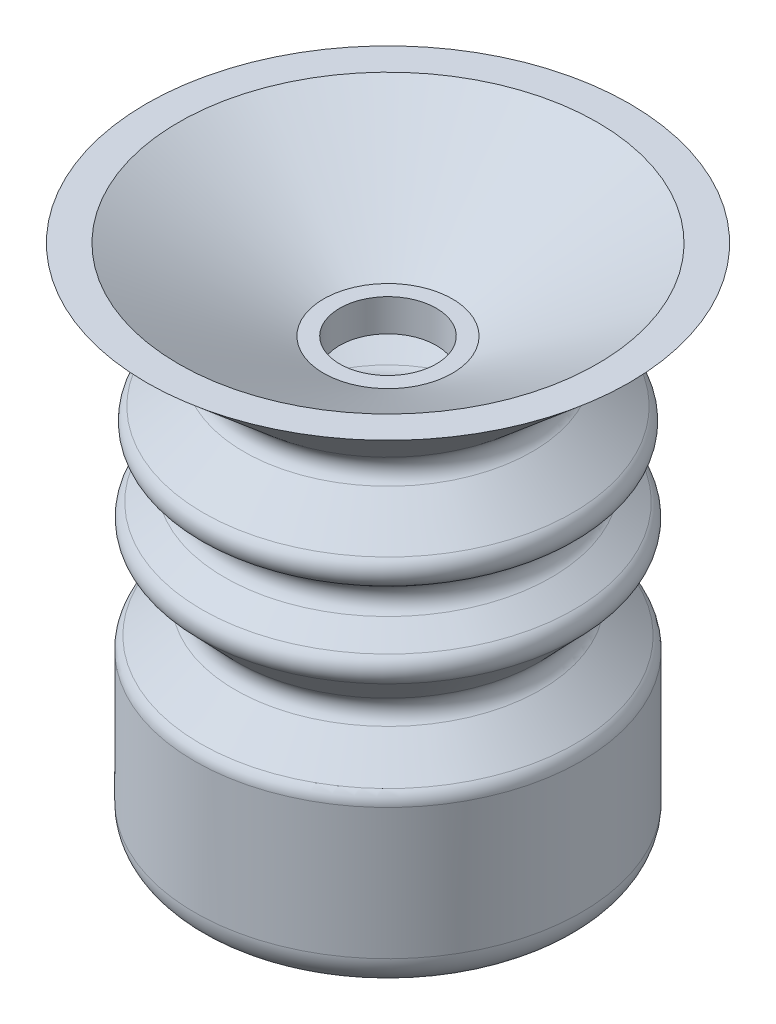
ISO-10303-21;
HEADER;
FILE_DESCRIPTION(('STEP AP214'),'2;1');
FILE_NAME('part.step','',(''),(''),'','','');
FILE_SCHEMA(('AUTOMOTIVE_DESIGN { 1 0 10303 214 1 1 1 1 }'));
ENDSEC;
DATA;
#1=APPLICATION_CONTEXT('core data for automotive mechanical design processes');
#2=APPLICATION_PROTOCOL_DEFINITION('international standard','automotive_design',2000,#1);
#3=PRODUCT_CONTEXT('',#1,'mechanical');
#4=PRODUCT('Part','Part','',(#3));
#5=PRODUCT_RELATED_PRODUCT_CATEGORY('part','',(#4));
#6=PRODUCT_DEFINITION_FORMATION('','',#4);
#7=PRODUCT_DEFINITION_CONTEXT('part definition',#1,'design');
#8=PRODUCT_DEFINITION('design','',#6,#7);
#9=PRODUCT_DEFINITION_SHAPE('','',#8);
#10=(LENGTH_UNIT() NAMED_UNIT(*) SI_UNIT(.MILLI.,.METRE.));
#11=(NAMED_UNIT(*) PLANE_ANGLE_UNIT() SI_UNIT($,.RADIAN.));
#12=(NAMED_UNIT(*) SI_UNIT($,.STERADIAN.) SOLID_ANGLE_UNIT());
#13=UNCERTAINTY_MEASURE_WITH_UNIT(LENGTH_MEASURE(1.E-05),#10,'distance_accuracy_value','');
#14=(GEOMETRIC_REPRESENTATION_CONTEXT(3) GLOBAL_UNCERTAINTY_ASSIGNED_CONTEXT((#13)) GLOBAL_UNIT_ASSIGNED_CONTEXT((#10,
#11,#12)) REPRESENTATION_CONTEXT('',''));
#15=CARTESIAN_POINT('',(0.,0.,0.));
#16=DIRECTION('',(0.,0.,1.));
#17=DIRECTION('',(1.,0.,0.));
#18=AXIS2_PLACEMENT_3D('',#15,#16,#17);
#19=CARTESIAN_POINT('',(6.,0.,0.));
#20=DIRECTION('',(0.,-1.,0.));
#21=DIRECTION('',(0.,0.,-1.));
#22=AXIS2_PLACEMENT_3D('',#19,#20,#21);
#23=PLANE('',#22);
#24=CARTESIAN_POINT('',(0.,0.,0.));
#25=DIRECTION('',(0.,-1.,0.));
#26=DIRECTION('',(0.,0.,-1.));
#27=AXIS2_PLACEMENT_3D('',#24,#25,#26);
#28=CIRCLE('',#27,5.);
#29=CARTESIAN_POINT('',(0.,0.,-5.));
#30=VERTEX_POINT('',#29);
#31=EDGE_CURVE('E37',#30,#30,#28,.T.);
#32=ORIENTED_EDGE('',*,*,#31,.T.);
#33=EDGE_LOOP('',(#32));
#34=FACE_BOUND('',#33,.T.);
#35=CARTESIAN_POINT('',(0.,0.,0.));
#36=DIRECTION('',(0.,-1.,0.));
#37=DIRECTION('',(0.,0.,-1.));
#38=AXIS2_PLACEMENT_3D('',#35,#36,#37);
#39=CIRCLE('',#38,2.5);
#40=CARTESIAN_POINT('',(0.,0.,-2.5));
#41=VERTEX_POINT('',#40);
#42=EDGE_CURVE('E104',#41,#41,#39,.T.);
#43=ORIENTED_EDGE('',*,*,#42,.F.);
#44=EDGE_LOOP('',(#43));
#45=FACE_BOUND('',#44,.T.);
#46=ADVANCED_FACE('F30',(#34,#45),#23,.T.);
#47=CARTESIAN_POINT('',(0.,0.,0.));
#48=DIRECTION('',(0.,-1.,0.));
#49=DIRECTION('',(0.,0.,-1.));
#50=AXIS2_PLACEMENT_3D('',#47,#48,#49);
#51=CYLINDRICAL_SURFACE('',#50,2.5);
#52=ORIENTED_EDGE('',*,*,#42,.T.);
#53=EDGE_LOOP('',(#52));
#54=FACE_BOUND('',#53,.T.);
#55=CARTESIAN_POINT('',(0.,3.,0.));
#56=DIRECTION('',(0.,-1.,0.));
#57=DIRECTION('',(0.,0.,-1.));
#58=AXIS2_PLACEMENT_3D('',#55,#56,#57);
#59=CIRCLE('',#58,2.5);
#60=CARTESIAN_POINT('',(0.,3.,-2.5));
#61=VERTEX_POINT('',#60);
#62=EDGE_CURVE('E107',#61,#61,#59,.T.);
#63=ORIENTED_EDGE('',*,*,#62,.F.);
#64=EDGE_LOOP('',(#63));
#65=FACE_BOUND('',#64,.T.);
#66=ADVANCED_FACE('F156',(#54,#65),#51,.F.);
#67=CARTESIAN_POINT('',(2.5,3.,0.));
#68=DIRECTION('',(0.,1.,0.));
#69=DIRECTION('',(0.,0.,1.));
#70=AXIS2_PLACEMENT_3D('',#67,#68,#69);
#71=PLANE('',#70);
#72=ORIENTED_EDGE('',*,*,#62,.T.);
#73=EDGE_LOOP('',(#72));
#74=FACE_BOUND('',#73,.T.);
#75=CARTESIAN_POINT('',(0.,3.,0.));
#76=DIRECTION('',(0.,-1.,0.));
#77=DIRECTION('',(0.,0.,-1.));
#78=AXIS2_PLACEMENT_3D('',#75,#76,#77);
#79=CIRCLE('',#78,3.5);
#80=CARTESIAN_POINT('',(0.,3.,-3.5));
#81=VERTEX_POINT('',#80);
#82=EDGE_CURVE('E110',#81,#81,#79,.T.);
#83=ORIENTED_EDGE('',*,*,#82,.F.);
#84=EDGE_LOOP('',(#83));
#85=FACE_BOUND('',#84,.T.);
#86=ADVANCED_FACE('F161',(#74,#85),#71,.T.);
#87=CARTESIAN_POINT('',(0.,0.,0.));
#88=DIRECTION('',(0.,-1.,0.));
#89=DIRECTION('',(0.,0.,-1.));
#90=AXIS2_PLACEMENT_3D('',#87,#88,#89);
#91=CYLINDRICAL_SURFACE('',#90,3.5);
#92=ORIENTED_EDGE('',*,*,#82,.T.);
#93=EDGE_LOOP('',(#92));
#94=FACE_BOUND('',#93,.T.);
#95=CARTESIAN_POINT('',(0.,5.,0.));
#96=DIRECTION('',(0.,-1.,0.));
#97=DIRECTION('',(0.,0.,-1.));
#98=AXIS2_PLACEMENT_3D('',#95,#96,#97);
#99=CIRCLE('',#98,3.5);
#100=CARTESIAN_POINT('',(0.,5.,-3.5));
#101=VERTEX_POINT('',#100);
#102=EDGE_CURVE('E113',#101,#101,#99,.T.);
#103=ORIENTED_EDGE('',*,*,#102,.F.);
#104=EDGE_LOOP('',(#103));
#105=FACE_BOUND('',#104,.T.);
#106=ADVANCED_FACE('F305',(#94,#105),#91,.F.);
#107=CARTESIAN_POINT('',(2.5,5.,0.));
#108=DIRECTION('',(0.,-1.,0.));
#109=DIRECTION('',(0.,0.,-1.));
#110=AXIS2_PLACEMENT_3D('',#107,#108,#109);
#111=PLANE('',#110);
#112=ORIENTED_EDGE('',*,*,#102,.T.);
#113=EDGE_LOOP('',(#112));
#114=FACE_BOUND('',#113,.T.);
#115=CARTESIAN_POINT('',(0.,5.,0.));
#116=DIRECTION('',(0.,-1.,0.));
#117=DIRECTION('',(0.,0.,-1.));
#118=AXIS2_PLACEMENT_3D('',#115,#116,#117);
#119=CIRCLE('',#118,2.5);
#120=CARTESIAN_POINT('',(0.,5.,-2.5));
#121=VERTEX_POINT('',#120);
#122=EDGE_CURVE('E116',#121,#121,#119,.T.);
#123=ORIENTED_EDGE('',*,*,#122,.F.);
#124=EDGE_LOOP('',(#123));
#125=FACE_BOUND('',#124,.T.);
#126=ADVANCED_FACE('F313',(#114,#125),#111,.T.);
#127=CARTESIAN_POINT('',(0.,0.,0.));
#128=DIRECTION('',(0.,-1.,0.));
#129=DIRECTION('',(0.,0.,-1.));
#130=AXIS2_PLACEMENT_3D('',#127,#128,#129);
#131=CYLINDRICAL_SURFACE('',#130,2.5);
#132=CARTESIAN_POINT('',(0.,7.03748536048925,0.));
#133=DIRECTION('',(0.,1.,0.));
#134=DIRECTION('',(0.,0.,1.));
#135=AXIS2_PLACEMENT_3D('',#132,#133,#134);
#136=CIRCLE('',#135,2.5);
#137=CARTESIAN_POINT('',(0.,7.03748536048925,2.5));
#138=VERTEX_POINT('',#137);
#139=EDGE_CURVE('E83',#138,#138,#136,.T.);
#140=ORIENTED_EDGE('',*,*,#139,.T.);
#141=EDGE_LOOP('',(#140));
#142=FACE_BOUND('',#141,.T.);
#143=ORIENTED_EDGE('',*,*,#122,.T.);
#144=EDGE_LOOP('',(#143));
#145=FACE_BOUND('',#144,.T.);
#146=ADVANCED_FACE('F322',(#142,#145),#131,.F.);
#147=CARTESIAN_POINT('',(0.,8.7,0.));
#148=DIRECTION('',(0.,1.,0.));
#149=DIRECTION('',(0.,0.,1.));
#150=AXIS2_PLACEMENT_3D('',#147,#148,#149);
#151=CONICAL_SURFACE('',#150,4.52953494659147,0.966939907955442);
#152=CARTESIAN_POINT('',(0.,8.29555694338188,0.));
#153=DIRECTION('',(0.,1.,0.));
#154=DIRECTION('',(0.,0.,1.));
#155=AXIS2_PLACEMENT_3D('',#152,#153,#154);
#156=CIRCLE('',#155,3.94322686279664);
#157=CARTESIAN_POINT('',(0.,8.29555694338188,3.94322686279664));
#158=VERTEX_POINT('',#157);
#159=EDGE_CURVE('E92',#158,#158,#156,.T.);
#160=ORIENTED_EDGE('',*,*,#159,.T.);
#161=EDGE_LOOP('',(#160));
#162=FACE_BOUND('',#161,.T.);
#163=CARTESIAN_POINT('',(0.,7.4490613531197,0.));
#164=DIRECTION('',(0.,-1.,0.));
#165=DIRECTION('',(0.,0.,-1.));
#166=AXIS2_PLACEMENT_3D('',#163,#164,#165);
#167=CIRCLE('',#166,2.71608944667332);
#168=CARTESIAN_POINT('',(0.,7.4490613531197,-2.71608944667332));
#169=VERTEX_POINT('',#168);
#170=EDGE_CURVE('E95',#169,#169,#167,.T.);
#171=ORIENTED_EDGE('',*,*,#170,.T.);
#172=EDGE_LOOP('',(#171));
#173=FACE_BOUND('',#172,.T.);
#174=ADVANCED_FACE('F332',(#162,#173),#151,.F.);
#175=CARTESIAN_POINT('',(0.,9.9072557164106,0.));
#176=DIRECTION('',(0.,-1.,0.));
#177=DIRECTION('',(0.,0.,-1.));
#178=AXIS2_PLACEMENT_3D('',#175,#176,#177);
#179=CONICAL_SURFACE('',#178,2.83937694361663,0.950546840812076);
#180=CARTESIAN_POINT('',(0.,9.11399967161569,0.));
#181=DIRECTION('',(0.,-1.,0.));
#182=DIRECTION('',(0.,0.,-1.));
#183=AXIS2_PLACEMENT_3D('',#180,#181,#182);
#184=CIRCLE('',#183,3.94993540632951);
#185=CARTESIAN_POINT('',(0.,9.11399967161569,-3.94993540632951));
#186=VERTEX_POINT('',#185);
#187=EDGE_CURVE('E98',#186,#186,#184,.T.);
#188=ORIENTED_EDGE('',*,*,#187,.T.);
#189=EDGE_LOOP('',(#188));
#190=FACE_BOUND('',#189,.T.);
#191=CARTESIAN_POINT('',(0.,9.50038898080723,0.));
#192=DIRECTION('',(0.,1.,0.));
#193=DIRECTION('',(0.,0.,1.));
#194=AXIS2_PLACEMENT_3D('',#191,#192,#193);
#195=CIRCLE('',#194,3.40899037346134);
#196=CARTESIAN_POINT('',(0.,9.50038898080723,3.40899037346134));
#197=VERTEX_POINT('',#196);
#198=EDGE_CURVE('E101',#197,#197,#195,.T.);
#199=ORIENTED_EDGE('',*,*,#198,.T.);
#200=EDGE_LOOP('',(#199));
#201=FACE_BOUND('',#200,.T.);
#202=ADVANCED_FACE('F341',(#190,#201),#179,.F.);
#203=CARTESIAN_POINT('',(0.,11.2,0.));
#204=DIRECTION('',(0.,1.,0.));
#205=DIRECTION('',(0.,0.,1.));
#206=AXIS2_PLACEMENT_3D('',#203,#204,#205);
#207=CONICAL_SURFACE('',#206,4.64921894064179,0.950546840812074);
#208=CARTESIAN_POINT('',(0.,10.314122452014,0.));
#209=DIRECTION('',(0.,-1.,0.));
#210=DIRECTION('',(0.,0.,-1.));
#211=AXIS2_PLACEMENT_3D('',#208,#209,#210);
#212=CIRCLE('',#211,3.40899037346134);
#213=CARTESIAN_POINT('',(0.,10.314122452014,-3.40899037346134));
#214=VERTEX_POINT('',#213);
#215=EDGE_CURVE('E86',#214,#214,#212,.T.);
#216=ORIENTED_EDGE('',*,*,#215,.T.);
#217=EDGE_LOOP('',(#216));
#218=FACE_BOUND('',#217,.T.);
#219=CARTESIAN_POINT('',(0.,10.8157151500665,0.));
#220=DIRECTION('',(0.,1.,0.));
#221=DIRECTION('',(0.,0.,1.));
#222=AXIS2_PLACEMENT_3D('',#219,#220,#221);
#223=CIRCLE('',#222,4.11122015073489);
#224=CARTESIAN_POINT('',(0.,10.8157151500665,4.11122015073489));
#225=VERTEX_POINT('',#224);
#226=EDGE_CURVE('E89',#225,#225,#223,.T.);
#227=ORIENTED_EDGE('',*,*,#226,.T.);
#228=EDGE_LOOP('',(#227));
#229=FACE_BOUND('',#228,.T.);
#230=ADVANCED_FACE('F350',(#218,#229),#207,.F.);
#231=CARTESIAN_POINT('',(0.,12.5,0.));
#232=DIRECTION('',(0.,-1.,0.));
#233=DIRECTION('',(0.,0.,-1.));
#234=AXIS2_PLACEMENT_3D('',#231,#232,#233);
#235=CONICAL_SURFACE('',#234,3.02421894064179,0.896055384571344);
#236=CARTESIAN_POINT('',(0.,11.6130162903914,0.));
#237=DIRECTION('',(0.,-1.,0.));
#238=DIRECTION('',(0.,0.,-1.));
#239=AXIS2_PLACEMENT_3D('',#236,#237,#238);
#240=CIRCLE('',#239,4.13294857765256);
#241=CARTESIAN_POINT('',(0.,11.6130162903914,-4.13294857765256));
#242=VERTEX_POINT('',#241);
#243=EDGE_CURVE('E45',#242,#242,#240,.T.);
#244=ORIENTED_EDGE('',*,*,#243,.T.);
#245=EDGE_LOOP('',(#244));
#246=FACE_BOUND('',#245,.T.);
#247=CARTESIAN_POINT('',(0.,12.5,0.));
#248=DIRECTION('',(0.,-1.,0.));
#249=DIRECTION('',(0.,0.,-1.));
#250=AXIS2_PLACEMENT_3D('',#247,#248,#249);
#251=CIRCLE('',#250,3.02421894064179);
#252=CARTESIAN_POINT('',(0.,12.5,-3.02421894064179));
#253=VERTEX_POINT('',#252);
#254=EDGE_CURVE('E119',#253,#253,#251,.T.);
#255=ORIENTED_EDGE('',*,*,#254,.F.);
#256=EDGE_LOOP('',(#255));
#257=FACE_BOUND('',#256,.T.);
#258=ADVANCED_FACE('F359',(#246,#257),#235,.F.);
#259=CARTESIAN_POINT('',(1.5,12.5,0.));
#260=DIRECTION('',(0.,-1.,0.));
#261=DIRECTION('',(0.,0.,-1.));
#262=AXIS2_PLACEMENT_3D('',#259,#260,#261);
#263=PLANE('',#262);
#264=ORIENTED_EDGE('',*,*,#254,.T.);
#265=EDGE_LOOP('',(#264));
#266=FACE_BOUND('',#265,.T.);
#267=CARTESIAN_POINT('',(0.,12.5,0.));
#268=DIRECTION('',(0.,-1.,0.));
#269=DIRECTION('',(0.,0.,-1.));
#270=AXIS2_PLACEMENT_3D('',#267,#268,#269);
#271=CIRCLE('',#270,1.5);
#272=CARTESIAN_POINT('',(0.,12.5,-1.5));
#273=VERTEX_POINT('',#272);
#274=EDGE_CURVE('E122',#273,#273,#271,.T.);
#275=ORIENTED_EDGE('',*,*,#274,.F.);
#276=EDGE_LOOP('',(#275));
#277=FACE_BOUND('',#276,.T.);
#278=ADVANCED_FACE('F368',(#266,#277),#263,.T.);
#279=CARTESIAN_POINT('',(0.,0.,0.));
#280=DIRECTION('',(0.,-1.,0.));
#281=DIRECTION('',(0.,0.,-1.));
#282=AXIS2_PLACEMENT_3D('',#279,#280,#281);
#283=CYLINDRICAL_SURFACE('',#282,1.5);
#284=ORIENTED_EDGE('',*,*,#274,.T.);
#285=EDGE_LOOP('',(#284));
#286=FACE_BOUND('',#285,.T.);
#287=CARTESIAN_POINT('',(0.,13.5,0.));
#288=DIRECTION('',(0.,-1.,0.));
#289=DIRECTION('',(0.,0.,-1.));
#290=AXIS2_PLACEMENT_3D('',#287,#288,#289);
#291=CIRCLE('',#290,1.5);
#292=CARTESIAN_POINT('',(0.,13.5,-1.5));
#293=VERTEX_POINT('',#292);
#294=EDGE_CURVE('E125',#293,#293,#291,.T.);
#295=ORIENTED_EDGE('',*,*,#294,.F.);
#296=EDGE_LOOP('',(#295));
#297=FACE_BOUND('',#296,.T.);
#298=ADVANCED_FACE('F377',(#286,#297),#283,.F.);
#299=CARTESIAN_POINT('',(2.,13.5,0.));
#300=DIRECTION('',(0.,1.,0.));
#301=DIRECTION('',(0.,0.,1.));
#302=AXIS2_PLACEMENT_3D('',#299,#300,#301);
#303=PLANE('',#302);
#304=ORIENTED_EDGE('',*,*,#294,.T.);
#305=EDGE_LOOP('',(#304));
#306=FACE_BOUND('',#305,.T.);
#307=CARTESIAN_POINT('',(0.,13.5,0.));
#308=DIRECTION('',(0.,-1.,0.));
#309=DIRECTION('',(0.,0.,-1.));
#310=AXIS2_PLACEMENT_3D('',#307,#308,#309);
#311=CIRCLE('',#310,2.);
#312=CARTESIAN_POINT('',(0.,13.5,2.));
#313=VERTEX_POINT('',#312);
#314=EDGE_CURVE('E128',#313,#313,#311,.T.);
#315=ORIENTED_EDGE('',*,*,#314,.F.);
#316=EDGE_LOOP('',(#315));
#317=FACE_BOUND('',#316,.T.);
#318=ADVANCED_FACE('F152',(#306,#317),#303,.T.);
#319=CARTESIAN_POINT('',(0.,16.,0.));
#320=DIRECTION('',(0.,1.,0.));
#321=DIRECTION('',(0.,0.,1.));
#322=AXIS2_PLACEMENT_3D('',#319,#320,#321);
#323=CONICAL_SURFACE('',#322,6.5,1.06369782240256);
#324=CARTESIAN_POINT('',(0.,16.,0.));
#325=DIRECTION('',(0.,-1.,0.));
#326=DIRECTION('',(0.,0.,-1.));
#327=AXIS2_PLACEMENT_3D('',#324,#325,#326);
#328=CIRCLE('',#327,6.5);
#329=CARTESIAN_POINT('',(0.,16.,6.5));
#330=VERTEX_POINT('',#329);
#331=EDGE_CURVE('E131',#330,#330,#328,.T.);
#332=CARTESIAN_POINT('',(0.,13.5,2.));
#333=CARTESIAN_POINT('',(0.,13.5260416666667,2.046875));
#334=CARTESIAN_POINT('',(0.,13.5520833333333,2.09375));
#335=CARTESIAN_POINT('',(0.,13.6041666666667,2.1875));
#336=CARTESIAN_POINT('',(0.,13.6302083333333,2.234375));
#337=CARTESIAN_POINT('',(0.,13.6822916666667,2.328125));
#338=CARTESIAN_POINT('',(0.,13.7083333333333,2.375));
#339=CARTESIAN_POINT('',(0.,13.7604166666667,2.46875));
#340=CARTESIAN_POINT('',(0.,13.7864583333333,2.515625));
#341=CARTESIAN_POINT('',(0.,13.8385416666667,2.609375));
#342=CARTESIAN_POINT('',(0.,13.8645833333333,2.65625));
#343=CARTESIAN_POINT('',(0.,13.9166666666667,2.75));
#344=CARTESIAN_POINT('',(0.,13.9427083333333,2.796875));
#345=CARTESIAN_POINT('',(0.,13.9947916666667,2.890625));
#346=CARTESIAN_POINT('',(0.,14.0208333333333,2.9375));
#347=CARTESIAN_POINT('',(0.,14.0729166666667,3.03125));
#348=CARTESIAN_POINT('',(0.,14.0989583333333,3.078125));
#349=CARTESIAN_POINT('',(0.,14.1510416666667,3.171875));
#350=CARTESIAN_POINT('',(0.,14.1770833333333,3.21875));
#351=CARTESIAN_POINT('',(0.,14.2291666666667,3.3125));
#352=CARTESIAN_POINT('',(0.,14.2552083333333,3.359375));
#353=CARTESIAN_POINT('',(0.,14.3072916666667,3.453125));
#354=CARTESIAN_POINT('',(0.,14.3333333333333,3.5));
#355=CARTESIAN_POINT('',(0.,14.3854166666667,3.59375));
#356=CARTESIAN_POINT('',(0.,14.4114583333333,3.640625));
#357=CARTESIAN_POINT('',(0.,14.4635416666667,3.734375));
#358=CARTESIAN_POINT('',(0.,14.4895833333333,3.78125));
#359=CARTESIAN_POINT('',(0.,14.5416666666667,3.875));
#360=CARTESIAN_POINT('',(0.,14.5677083333333,3.921875));
#361=CARTESIAN_POINT('',(0.,14.6197916666667,4.015625));
#362=CARTESIAN_POINT('',(0.,14.6458333333333,4.0625));
#363=CARTESIAN_POINT('',(0.,14.6979166666667,4.15625));
#364=CARTESIAN_POINT('',(0.,14.7239583333333,4.203125));
#365=CARTESIAN_POINT('',(0.,14.7760416666667,4.296875));
#366=CARTESIAN_POINT('',(0.,14.8020833333333,4.34375));
#367=CARTESIAN_POINT('',(0.,14.8541666666667,4.4375));
#368=CARTESIAN_POINT('',(0.,14.8802083333333,4.484375));
#369=CARTESIAN_POINT('',(0.,14.9322916666667,4.578125));
#370=CARTESIAN_POINT('',(0.,14.9583333333333,4.625));
#371=CARTESIAN_POINT('',(0.,15.0104166666667,4.71875));
#372=CARTESIAN_POINT('',(0.,15.0364583333333,4.765625));
#373=CARTESIAN_POINT('',(0.,15.0885416666667,4.859375));
#374=CARTESIAN_POINT('',(0.,15.1145833333333,4.90625));
#375=CARTESIAN_POINT('',(0.,15.1666666666667,5.));
#376=CARTESIAN_POINT('',(0.,15.1927083333333,5.046875));
#377=CARTESIAN_POINT('',(0.,15.2447916666667,5.140625));
#378=CARTESIAN_POINT('',(0.,15.2708333333333,5.1875));
#379=CARTESIAN_POINT('',(0.,15.3229166666667,5.28125));
#380=CARTESIAN_POINT('',(0.,15.3489583333333,5.328125));
#381=CARTESIAN_POINT('',(0.,15.4010416666667,5.421875));
#382=CARTESIAN_POINT('',(0.,15.4270833333333,5.46875));
#383=CARTESIAN_POINT('',(0.,15.4791666666667,5.5625));
#384=CARTESIAN_POINT('',(0.,15.5052083333333,5.609375));
#385=CARTESIAN_POINT('',(0.,15.5572916666667,5.703125));
#386=CARTESIAN_POINT('',(0.,15.5833333333333,5.75));
#387=CARTESIAN_POINT('',(0.,15.6354166666667,5.84375));
#388=CARTESIAN_POINT('',(0.,15.6614583333333,5.890625));
#389=CARTESIAN_POINT('',(0.,15.7135416666667,5.984375));
#390=CARTESIAN_POINT('',(0.,15.7395833333333,6.03125));
#391=CARTESIAN_POINT('',(0.,15.7916666666667,6.125));
#392=CARTESIAN_POINT('',(0.,15.8177083333333,6.171875));
#393=CARTESIAN_POINT('',(0.,15.8697916666667,6.265625));
#394=CARTESIAN_POINT('',(0.,15.8958333333333,6.3125));
#395=CARTESIAN_POINT('',(0.,15.9479166666667,6.40625));
#396=CARTESIAN_POINT('',(0.,15.9739583333333,6.453125));
#397=CARTESIAN_POINT('',(0.,16.,6.5));
#398=B_SPLINE_CURVE_WITH_KNOTS('',3,(#332,#333,#334,#335,#336,#337,#338,#339,#340,#341,#342,
#343,#344,#345,#346,#347,#348,#349,#350,#351,#352,#353,#354,#355,#356,#357,#358,#359,#360,#361,
#362,#363,#364,#365,#366,#367,#368,#369,#370,#371,#372,#373,#374,#375,#376,#377,#378,#379,#380,
#381,#382,#383,#384,#385,#386,#387,#388,#389,#390,#391,#392,#393,#394,#395,#396,#397),
.UNSPECIFIED.,.F.,.F.,(4,2,2,2,2,2,2,2,2,2,2,2,2,2,2,2,2,2,2,2,2,2,2,2,2,2,2,2,2,2,2,2,4),(0.,
0.160869220952921,0.321738441905844,0.482607662858765,0.643476883811688,0.804346104764609,
0.965215325717532,1.12608454667045,1.28695376762337,1.4478229885763,1.60869220952922,
1.76956143048214,1.93043065143506,2.09129987238798,2.25216909334091,2.41303831429383,
2.57390753524675,2.73477675619967,2.89564597715259,3.05651519810552,3.21738441905844,
3.37825364001136,3.53912286096428,3.6999920819172,3.86086130287012,4.02173052382305,
4.18259974477597,4.34346896572889,4.50433818668181,4.66520740763473,4.82607662858766,
4.98694584954058,5.1478150704935),.UNSPECIFIED.);
#399=EDGE_CURVE('BSEAM142',#313,#330,#398,.T.);
#400=ORIENTED_EDGE('',*,*,#314,.T.);
#401=ORIENTED_EDGE('',*,*,#331,.F.);
#402=ORIENTED_EDGE('',*,*,#399,.T.);
#403=ORIENTED_EDGE('',*,*,#399,.F.);
#404=EDGE_LOOP('',(#400,#402,#401,#403));
#405=FACE_BOUND('',#404,.T.);
#406=ADVANCED_FACE('F142',(#405),#323,.F.);
#407=CARTESIAN_POINT('',(6.5,16.,0.));
#408=DIRECTION('',(0.,1.,0.));
#409=DIRECTION('',(0.,0.,1.));
#410=AXIS2_PLACEMENT_3D('',#407,#408,#409);
#411=PLANE('',#410);
#412=ORIENTED_EDGE('',*,*,#331,.T.);
#413=EDGE_LOOP('',(#412));
#414=FACE_BOUND('',#413,.T.);
#415=CARTESIAN_POINT('',(0.,16.,0.));
#416=DIRECTION('',(0.,-1.,0.));
#417=DIRECTION('',(0.,0.,-1.));
#418=AXIS2_PLACEMENT_3D('',#415,#416,#417);
#419=CIRCLE('',#418,7.5);
#420=CARTESIAN_POINT('',(0.,16.,-7.5));
#421=VERTEX_POINT('',#420);
#422=EDGE_CURVE('E134',#421,#421,#419,.T.);
#423=ORIENTED_EDGE('',*,*,#422,.F.);
#424=EDGE_LOOP('',(#423));
#425=FACE_BOUND('',#424,.T.);
#426=ADVANCED_FACE('F140',(#414,#425),#411,.T.);
#427=CARTESIAN_POINT('',(0.,13.,0.));
#428=DIRECTION('',(0.,1.,0.));
#429=DIRECTION('',(0.,0.,1.));
#430=AXIS2_PLACEMENT_3D('',#427,#428,#429);
#431=CONICAL_SURFACE('',#430,4.,0.862170054667226);
#432=CARTESIAN_POINT('',(0.,13.3929090563156,0.));
#433=DIRECTION('',(0.,1.,0.));
#434=DIRECTION('',(0.,0.,1.));
#435=AXIS2_PLACEMENT_3D('',#432,#433,#434);
#436=CIRCLE('',#435,4.4583938990349);
#437=CARTESIAN_POINT('',(0.,13.3929090563156,4.4583938990349));
#438=VERTEX_POINT('',#437);
#439=EDGE_CURVE('E41',#438,#438,#436,.T.);
#440=ORIENTED_EDGE('',*,*,#439,.T.);
#441=EDGE_LOOP('',(#440));
#442=FACE_BOUND('',#441,.T.);
#443=ORIENTED_EDGE('',*,*,#422,.T.);
#444=EDGE_LOOP('',(#443));
#445=FACE_BOUND('',#444,.T.);
#446=ADVANCED_FACE('F138',(#442,#445),#431,.T.);
#447=CARTESIAN_POINT('',(0.,11.2,0.));
#448=DIRECTION('',(0.,-1.,0.));
#449=DIRECTION('',(0.,0.,-1.));
#450=AXIS2_PLACEMENT_3D('',#447,#448,#449);
#451=CONICAL_SURFACE('',#450,6.25,0.896055384571344);
#452=CARTESIAN_POINT('',(0.,11.6130162903914,0.));
#453=DIRECTION('',(0.,1.,0.));
#454=DIRECTION('',(0.,0.,1.));
#455=AXIS2_PLACEMENT_3D('',#452,#453,#454);
#456=CIRCLE('',#455,5.73372963701077);
#457=CARTESIAN_POINT('',(0.,11.6130162903914,5.73372963701077));
#458=VERTEX_POINT('',#457);
#459=EDGE_CURVE('E71',#458,#458,#456,.T.);
#460=ORIENTED_EDGE('',*,*,#459,.T.);
#461=EDGE_LOOP('',(#460));
#462=FACE_BOUND('',#461,.T.);
#463=CARTESIAN_POINT('',(0.,12.6228463504115,0.));
#464=DIRECTION('',(0.,-1.,0.));
#465=DIRECTION('',(0.,0.,-1.));
#466=AXIS2_PLACEMENT_3D('',#463,#464,#465);
#467=CIRCLE('',#466,4.47144206198567);
#468=CARTESIAN_POINT('',(0.,12.6228463504115,-4.47144206198567));
#469=VERTEX_POINT('',#468);
#470=EDGE_CURVE('E74',#469,#469,#467,.T.);
#471=ORIENTED_EDGE('',*,*,#470,.T.);
#472=EDGE_LOOP('',(#471));
#473=FACE_BOUND('',#472,.T.);
#474=ADVANCED_FACE('F149',(#462,#473),#451,.T.);
#475=CARTESIAN_POINT('',(0.,9.95,0.));
#476=DIRECTION('',(0.,1.,0.));
#477=DIRECTION('',(0.,0.,1.));
#478=AXIS2_PLACEMENT_3D('',#475,#476,#477);
#479=CONICAL_SURFACE('',#478,4.5,0.950546840812075);
#480=CARTESIAN_POINT('',(0.,10.8157151500665,0.));
#481=DIRECTION('',(0.,-1.,0.));
#482=DIRECTION('',(0.,0.,-1.));
#483=AXIS2_PLACEMENT_3D('',#480,#481,#482);
#484=CIRCLE('',#483,5.71200121009311);
#485=CARTESIAN_POINT('',(0.,10.8157151500665,-5.71200121009311));
#486=VERTEX_POINT('',#485);
#487=EDGE_CURVE('E77',#486,#486,#484,.T.);
#488=ORIENTED_EDGE('',*,*,#487,.T.);
#489=EDGE_LOOP('',(#488));
#490=FACE_BOUND('',#489,.T.);
#491=CARTESIAN_POINT('',(0.,10.3568667356034,0.));
#492=DIRECTION('',(0.,1.,0.));
#493=DIRECTION('',(0.,0.,1.));
#494=AXIS2_PLACEMENT_3D('',#491,#492,#493);
#495=CIRCLE('',#494,5.06961342984471);
#496=CARTESIAN_POINT('',(0.,10.3568667356034,5.06961342984471));
#497=VERTEX_POINT('',#496);
#498=EDGE_CURVE('E80',#497,#497,#495,.T.);
#499=ORIENTED_EDGE('',*,*,#498,.T.);
#500=EDGE_LOOP('',(#499));
#501=FACE_BOUND('',#500,.T.);
#502=ADVANCED_FACE('F215',(#490,#501),#479,.T.);
#503=CARTESIAN_POINT('',(0.,8.7,0.));
#504=DIRECTION('',(0.,-1.,0.));
#505=DIRECTION('',(0.,0.,-1.));
#506=AXIS2_PLACEMENT_3D('',#503,#504,#505);
#507=CONICAL_SURFACE('',#506,6.25,0.950546840812076);
#508=CARTESIAN_POINT('',(0.,9.03591511399486,0.));
#509=DIRECTION('',(0.,1.,0.));
#510=DIRECTION('',(0.,0.,1.));
#511=AXIS2_PLACEMENT_3D('',#508,#509,#510);
#512=CIRCLE('',#511,5.7797188404072);
#513=CARTESIAN_POINT('',(0.,9.03591511399486,5.7797188404072));
#514=VERTEX_POINT('',#513);
#515=EDGE_CURVE('E50',#514,#514,#512,.T.);
#516=ORIENTED_EDGE('',*,*,#515,.T.);
#517=EDGE_LOOP('',(#516));
#518=FACE_BOUND('',#517,.T.);
#519=CARTESIAN_POINT('',(0.,9.54313326439663,0.));
#520=DIRECTION('',(0.,-1.,0.));
#521=DIRECTION('',(0.,0.,-1.));
#522=AXIS2_PLACEMENT_3D('',#519,#520,#521);
#523=CIRCLE('',#522,5.06961342984471);
#524=CARTESIAN_POINT('',(0.,9.54313326439663,-5.06961342984471));
#525=VERTEX_POINT('',#524);
#526=EDGE_CURVE('E53',#525,#525,#523,.T.);
#527=ORIENTED_EDGE('',*,*,#526,.T.);
#528=EDGE_LOOP('',(#527));
#529=FACE_BOUND('',#528,.T.);
#530=ADVANCED_FACE('F221',(#518,#529),#507,.T.);
#531=CARTESIAN_POINT('',(0.,6.7,0.));
#532=DIRECTION('',(0.,1.,0.));
#533=DIRECTION('',(0.,0.,1.));
#534=AXIS2_PLACEMENT_3D('',#531,#532,#533);
#535=CONICAL_SURFACE('',#534,4.3315449703681,0.76459067649956);
#536=CARTESIAN_POINT('',(0.,7.08564716814076,0.));
#537=DIRECTION('',(0.,1.,0.));
#538=DIRECTION('',(0.,0.,1.));
#539=AXIS2_PLACEMENT_3D('',#536,#537,#538);
#540=CIRCLE('',#539,4.70146834505957);
#541=CARTESIAN_POINT('',(0.,7.08564716814076,4.70146834505957));
#542=VERTEX_POINT('',#541);
#543=EDGE_CURVE('E56',#542,#542,#540,.T.);
#544=ORIENTED_EDGE('',*,*,#543,.T.);
#545=EDGE_LOOP('',(#544));
#546=FACE_BOUND('',#545,.T.);
#547=CARTESIAN_POINT('',(0.,8.28292754748942,0.));
#548=DIRECTION('',(0.,-1.,0.));
#549=DIRECTION('',(0.,0.,-1.));
#550=AXIS2_PLACEMENT_3D('',#547,#548,#549);
#551=CIRCLE('',#550,5.84993262788008);
#552=CARTESIAN_POINT('',(0.,8.28292754748942,-5.84993262788008));
#553=VERTEX_POINT('',#552);
#554=EDGE_CURVE('E59',#553,#553,#551,.T.);
#555=ORIENTED_EDGE('',*,*,#554,.T.);
#556=EDGE_LOOP('',(#555));
#557=FACE_BOUND('',#556,.T.);
#558=ADVANCED_FACE('F227',(#546,#557),#535,.T.);
#559=CARTESIAN_POINT('',(0.,5.3,0.));
#560=DIRECTION('',(0.,-1.,0.));
#561=DIRECTION('',(0.,0.,-1.));
#562=AXIS2_PLACEMENT_3D('',#559,#560,#561);
#563=CONICAL_SURFACE('',#562,6.,0.872664625997167);
#564=CARTESIAN_POINT('',(0.,5.44986839248199,0.));
#565=DIRECTION('',(0.,1.,0.));
#566=DIRECTION('',(0.,0.,1.));
#567=AXIS2_PLACEMENT_3D('',#564,#565,#566);
#568=CIRCLE('',#567,5.82139380484327);
#569=CARTESIAN_POINT('',(0.,5.44986839248199,5.82139380484327));
#570=VERTEX_POINT('',#569);
#571=EDGE_CURVE('E62',#570,#570,#568,.T.);
#572=ORIENTED_EDGE('',*,*,#571,.T.);
#573=EDGE_LOOP('',(#572));
#574=FACE_BOUND('',#573,.T.);
#575=CARTESIAN_POINT('',(0.,6.35650411567921,0.));
#576=DIRECTION('',(0.,-1.,0.));
#577=DIRECTION('',(0.,0.,-1.));
#578=AXIS2_PLACEMENT_3D('',#575,#576,#577);
#579=CIRCLE('',#578,4.74090742454873);
#580=CARTESIAN_POINT('',(0.,6.35650411567921,-4.74090742454873));
#581=VERTEX_POINT('',#580);
#582=EDGE_CURVE('E65',#581,#581,#579,.T.);
#583=ORIENTED_EDGE('',*,*,#582,.T.);
#584=EDGE_LOOP('',(#583));
#585=FACE_BOUND('',#584,.T.);
#586=ADVANCED_FACE('F231',(#574,#585),#563,.T.);
#587=CARTESIAN_POINT('',(0.,0.,0.));
#588=DIRECTION('',(0.,-1.,0.));
#589=DIRECTION('',(0.,0.,-1.));
#590=AXIS2_PLACEMENT_3D('',#587,#588,#589);
#591=CYLINDRICAL_SURFACE('',#590,6.);
#592=CARTESIAN_POINT('',(0.,1.,0.));
#593=DIRECTION('',(0.,-1.,0.));
#594=DIRECTION('',(0.,0.,-1.));
#595=AXIS2_PLACEMENT_3D('',#592,#593,#594);
#596=CIRCLE('',#595,6.);
#597=CARTESIAN_POINT('',(0.,1.,-6.));
#598=VERTEX_POINT('',#597);
#599=EDGE_CURVE('E10',#598,#598,#596,.F.);
#600=ORIENTED_EDGE('',*,*,#599,.T.);
#601=EDGE_LOOP('',(#600));
#602=FACE_BOUND('',#601,.T.);
#603=CARTESIAN_POINT('',(0.,5.0668461709225,0.));
#604=DIRECTION('',(0.,1.,0.));
#605=DIRECTION('',(0.,0.,1.));
#606=AXIS2_PLACEMENT_3D('',#603,#604,#605);
#607=CIRCLE('',#606,6.);
#608=CARTESIAN_POINT('',(0.,5.0668461709225,6.));
#609=VERTEX_POINT('',#608);
#610=EDGE_CURVE('E68',#609,#609,#607,.F.);
#611=ORIENTED_EDGE('',*,*,#610,.T.);
#612=EDGE_LOOP('',(#611));
#613=FACE_BOUND('',#612,.T.);
#614=ADVANCED_FACE('F171',(#602,#613),#591,.T.);
#615=CARTESIAN_POINT('',(0.,8.70713293601232,0.));
#616=DIRECTION('',(0.,-1.,0.));
#617=DIRECTION('',(0.,0.,-1.));
#618=AXIS2_PLACEMENT_3D('',#615,#616,#617);
#619=TOROIDAL_SURFACE('',#618,3.65931630946996,0.5);
#620=ORIENTED_EDGE('',*,*,#159,.F.);
#621=EDGE_LOOP('',(#620));
#622=FACE_BOUND('',#621,.T.);
#623=ORIENTED_EDGE('',*,*,#187,.F.);
#624=EDGE_LOOP('',(#623));
#625=FACE_BOUND('',#624,.T.);
#626=ADVANCED_FACE('F167',(#622,#625),#619,.F.);
#627=CARTESIAN_POINT('',(0.,9.9072557164106,0.));
#628=DIRECTION('',(0.,1.,0.));
#629=DIRECTION('',(0.,0.,1.));
#630=AXIS2_PLACEMENT_3D('',#627,#628,#629);
#631=TOROIDAL_SURFACE('',#630,3.69960947032089,0.5);
#632=ORIENTED_EDGE('',*,*,#198,.F.);
#633=EDGE_LOOP('',(#632));
#634=FACE_BOUND('',#633,.T.);
#635=ORIENTED_EDGE('',*,*,#215,.F.);
#636=EDGE_LOOP('',(#635));
#637=FACE_BOUND('',#636,.T.);
#638=ADVANCED_FACE('F170',(#634,#637),#631,.T.);
#639=CARTESIAN_POINT('',(0.,7.03748536048925,0.));
#640=DIRECTION('',(0.,1.,0.));
#641=DIRECTION('',(0.,0.,1.));
#642=AXIS2_PLACEMENT_3D('',#639,#640,#641);
#643=TOROIDAL_SURFACE('',#642,3.,0.5);
#644=ORIENTED_EDGE('',*,*,#139,.F.);
#645=EDGE_LOOP('',(#644));
#646=FACE_BOUND('',#645,.T.);
#647=ORIENTED_EDGE('',*,*,#170,.F.);
#648=EDGE_LOOP('',(#647));
#649=FACE_BOUND('',#648,.T.);
#650=ADVANCED_FACE('F175',(#646,#649),#643,.T.);
#651=CARTESIAN_POINT('',(0.,11.2225818856699,0.));
#652=DIRECTION('',(0.,1.,0.));
#653=DIRECTION('',(0.,0.,1.));
#654=AXIS2_PLACEMENT_3D('',#651,#652,#653);
#655=TOROIDAL_SURFACE('',#654,5.42138211323356,0.5);
#656=ORIENTED_EDGE('',*,*,#459,.F.);
#657=EDGE_LOOP('',(#656));
#658=FACE_BOUND('',#657,.T.);
#659=ORIENTED_EDGE('',*,*,#487,.F.);
#660=EDGE_LOOP('',(#659));
#661=FACE_BOUND('',#660,.T.);
#662=ADVANCED_FACE('F179',(#658,#661),#655,.T.);
#663=CARTESIAN_POINT('',(0.,5.0668461709225,0.));
#664=DIRECTION('',(0.,1.,0.));
#665=DIRECTION('',(0.,0.,1.));
#666=AXIS2_PLACEMENT_3D('',#663,#664,#665);
#667=TOROIDAL_SURFACE('',#666,5.5,0.5);
#668=ORIENTED_EDGE('',*,*,#571,.F.);
#669=EDGE_LOOP('',(#668));
#670=FACE_BOUND('',#669,.T.);
#671=ORIENTED_EDGE('',*,*,#610,.F.);
#672=EDGE_LOOP('',(#671));
#673=FACE_BOUND('',#672,.T.);
#674=ADVANCED_FACE('F183',(#670,#673),#667,.T.);
#675=CARTESIAN_POINT('',(0.,6.73952633723869,0.));
#676=DIRECTION('',(0.,-1.,0.));
#677=DIRECTION('',(0.,0.,-1.));
#678=AXIS2_PLACEMENT_3D('',#675,#676,#677);
#679=TOROIDAL_SURFACE('',#678,5.062301229392,0.5);
#680=ORIENTED_EDGE('',*,*,#543,.F.);
#681=EDGE_LOOP('',(#680));
#682=FACE_BOUND('',#681,.T.);
#683=ORIENTED_EDGE('',*,*,#582,.F.);
#684=EDGE_LOOP('',(#683));
#685=FACE_BOUND('',#684,.T.);
#686=ADVANCED_FACE('F187',(#682,#685),#679,.F.);
#687=CARTESIAN_POINT('',(0.,8.62904837839149,0.));
#688=DIRECTION('',(0.,1.,0.));
#689=DIRECTION('',(0.,0.,1.));
#690=AXIS2_PLACEMENT_3D('',#687,#688,#689);
#691=TOROIDAL_SURFACE('',#690,5.48909974354765,0.5);
#692=ORIENTED_EDGE('',*,*,#515,.F.);
#693=EDGE_LOOP('',(#692));
#694=FACE_BOUND('',#693,.T.);
#695=ORIENTED_EDGE('',*,*,#554,.F.);
#696=EDGE_LOOP('',(#695));
#697=FACE_BOUND('',#696,.T.);
#698=ADVANCED_FACE('F191',(#694,#697),#691,.T.);
#699=CARTESIAN_POINT('',(0.,9.95,0.));
#700=DIRECTION('',(0.,-1.,0.));
#701=DIRECTION('',(0.,0.,-1.));
#702=AXIS2_PLACEMENT_3D('',#699,#700,#701);
#703=TOROIDAL_SURFACE('',#702,5.36023252670426,0.5);
#704=ORIENTED_EDGE('',*,*,#498,.F.);
#705=EDGE_LOOP('',(#704));
#706=FACE_BOUND('',#705,.T.);
#707=ORIENTED_EDGE('',*,*,#526,.F.);
#708=EDGE_LOOP('',(#707));
#709=FACE_BOUND('',#708,.T.);
#710=ADVANCED_FACE('F195',(#706,#709),#703,.F.);
#711=CARTESIAN_POINT('',(0.,11.2225818856699,0.));
#712=DIRECTION('',(0.,-1.,0.));
#713=DIRECTION('',(0.,0.,-1.));
#714=AXIS2_PLACEMENT_3D('',#711,#712,#713);
#715=TOROIDAL_SURFACE('',#714,3.82060105387534,0.5);
#716=ORIENTED_EDGE('',*,*,#226,.F.);
#717=EDGE_LOOP('',(#716));
#718=FACE_BOUND('',#717,.T.);
#719=ORIENTED_EDGE('',*,*,#243,.F.);
#720=EDGE_LOOP('',(#719));
#721=FACE_BOUND('',#720,.T.);
#722=ADVANCED_FACE('F199',(#718,#721),#715,.F.);
#723=CARTESIAN_POINT('',(0.,13.013280755133,0.));
#724=DIRECTION('',(0.,-1.,0.));
#725=DIRECTION('',(0.,0.,-1.));
#726=AXIS2_PLACEMENT_3D('',#723,#724,#725);
#727=TOROIDAL_SURFACE('',#726,4.78378958576288,0.5);
#728=ORIENTED_EDGE('',*,*,#439,.F.);
#729=EDGE_LOOP('',(#728));
#730=FACE_BOUND('',#729,.T.);
#731=ORIENTED_EDGE('',*,*,#470,.F.);
#732=EDGE_LOOP('',(#731));
#733=FACE_BOUND('',#732,.T.);
#734=ADVANCED_FACE('F202',(#730,#733),#727,.F.);
#735=CARTESIAN_POINT('',(0.,1.,0.));
#736=DIRECTION('',(0.,-1.,0.));
#737=DIRECTION('',(0.,0.,-1.));
#738=AXIS2_PLACEMENT_3D('',#735,#736,#737);
#739=TOROIDAL_SURFACE('',#738,5.,1.);
#740=ORIENTED_EDGE('',*,*,#599,.F.);
#741=EDGE_LOOP('',(#740));
#742=FACE_BOUND('',#741,.T.);
#743=ORIENTED_EDGE('',*,*,#31,.F.);
#744=EDGE_LOOP('',(#743));
#745=FACE_BOUND('',#744,.T.);
#746=ADVANCED_FACE('F32',(#742,#745),#739,.T.);
#747=CLOSED_SHELL('',(#46,#66,#86,#106,#126,#146,#174,#202,#230,#258,#278,#298,#318,#406,#426,
#446,#474,#502,#530,#558,#586,#614,#626,#638,#650,#662,#674,#686,#698,#710,#722,#734,#746));
#748=MANIFOLD_SOLID_BREP('B2',#747);
#749=ADVANCED_BREP_SHAPE_REPRESENTATION('',(#18,#748),#14);
#750=SHAPE_DEFINITION_REPRESENTATION(#9,#749);
ENDSEC;
END-ISO-10303-21;
